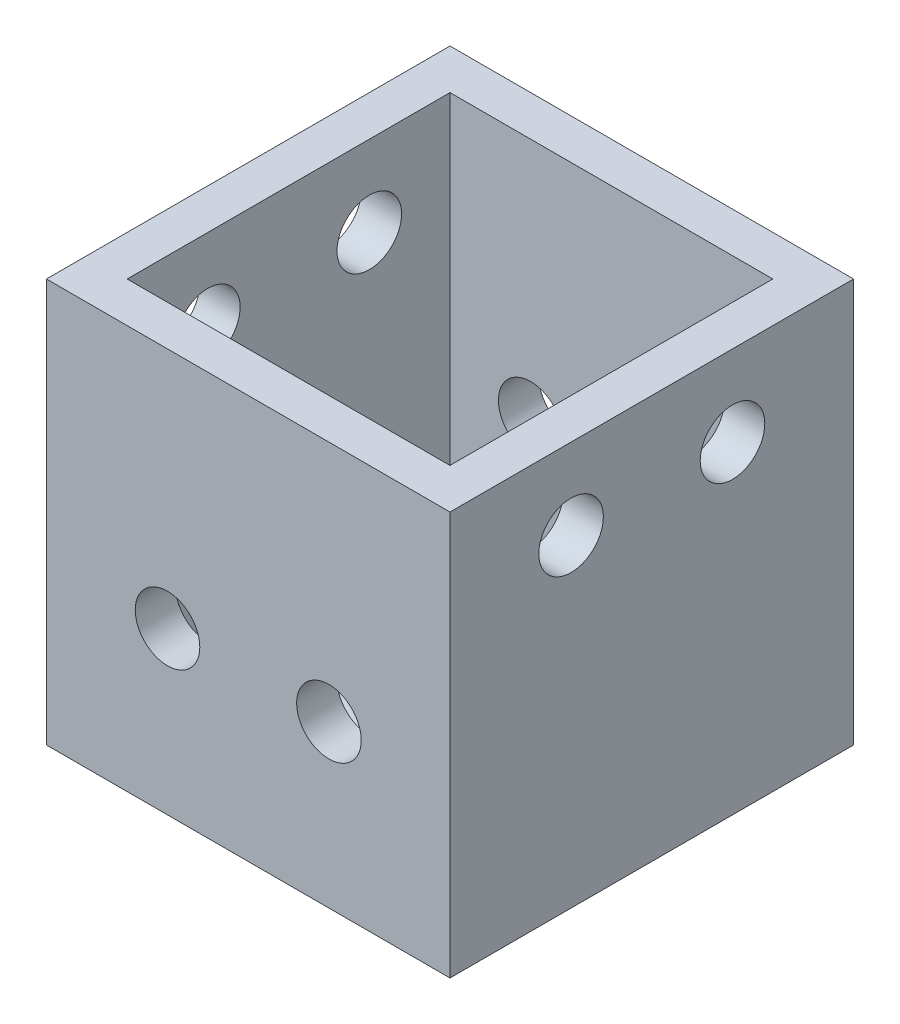
ISO-10303-21;
HEADER;
FILE_DESCRIPTION(('STEP AP214'),'2;1');
FILE_NAME('part.step','',(''),(''),'','','');
FILE_SCHEMA(('AUTOMOTIVE_DESIGN { 1 0 10303 214 1 1 1 1 }'));
ENDSEC;
DATA;
#1=APPLICATION_CONTEXT('core data for automotive mechanical design processes');
#2=APPLICATION_PROTOCOL_DEFINITION('international standard','automotive_design',2000,#1);
#3=PRODUCT_CONTEXT('',#1,'mechanical');
#4=PRODUCT('Part','Part','',(#3));
#5=PRODUCT_RELATED_PRODUCT_CATEGORY('part','',(#4));
#6=PRODUCT_DEFINITION_FORMATION('','',#4);
#7=PRODUCT_DEFINITION_CONTEXT('part definition',#1,'design');
#8=PRODUCT_DEFINITION('design','',#6,#7);
#9=PRODUCT_DEFINITION_SHAPE('','',#8);
#10=(LENGTH_UNIT() NAMED_UNIT(*) SI_UNIT(.MILLI.,.METRE.));
#11=(NAMED_UNIT(*) PLANE_ANGLE_UNIT() SI_UNIT($,.RADIAN.));
#12=(NAMED_UNIT(*) SI_UNIT($,.STERADIAN.) SOLID_ANGLE_UNIT());
#13=UNCERTAINTY_MEASURE_WITH_UNIT(LENGTH_MEASURE(1.E-05),#10,'distance_accuracy_value','');
#14=(GEOMETRIC_REPRESENTATION_CONTEXT(3) GLOBAL_UNCERTAINTY_ASSIGNED_CONTEXT((#13)) GLOBAL_UNIT_ASSIGNED_CONTEXT((#10,
#11,#12)) REPRESENTATION_CONTEXT('',''));
#15=CARTESIAN_POINT('',(0.,0.,0.));
#16=DIRECTION('',(0.,0.,1.));
#17=DIRECTION('',(1.,0.,0.));
#18=AXIS2_PLACEMENT_3D('',#15,#16,#17);
#19=CARTESIAN_POINT('',(0.,50.,0.));
#20=DIRECTION('',(1.,0.,0.));
#21=DIRECTION('',(0.,0.,-1.));
#22=AXIS2_PLACEMENT_3D('',#19,#20,#21);
#23=PLANE('',#22);
#24=CARTESIAN_POINT('',(0.,40.,-15.));
#25=DIRECTION('',(1.,0.,0.));
#26=DIRECTION('',(0.,0.,-1.));
#27=AXIS2_PLACEMENT_3D('',#24,#25,#26);
#28=CIRCLE('',#27,4.);
#29=CARTESIAN_POINT('',(0.,40.,-19.));
#30=VERTEX_POINT('',#29);
#31=EDGE_CURVE('E181',#30,#30,#28,.T.);
#32=ORIENTED_EDGE('',*,*,#31,.T.);
#33=EDGE_LOOP('',(#32));
#34=FACE_BOUND('',#33,.T.);
#35=CARTESIAN_POINT('',(0.,40.,-35.));
#36=DIRECTION('',(1.,0.,0.));
#37=DIRECTION('',(0.,0.,-1.));
#38=AXIS2_PLACEMENT_3D('',#35,#36,#37);
#39=CIRCLE('',#38,4.00000000000001);
#40=CARTESIAN_POINT('',(0.,40.,-39.));
#41=VERTEX_POINT('',#40);
#42=EDGE_CURVE('E188',#41,#41,#39,.T.);
#43=ORIENTED_EDGE('',*,*,#42,.T.);
#44=EDGE_LOOP('',(#43));
#45=FACE_BOUND('',#44,.T.);
#46=DIRECTION('',(0.,0.,1.));
#47=VECTOR('',#46,1.);
#48=CARTESIAN_POINT('',(0.,0.,0.));
#49=LINE('',#48,#47);
#50=CARTESIAN_POINT('',(0.,0.,-50.));
#51=VERTEX_POINT('',#50);
#52=CARTESIAN_POINT('',(0.,0.,0.));
#53=VERTEX_POINT('',#52);
#54=EDGE_CURVE('E146',#51,#53,#49,.T.);
#55=ORIENTED_EDGE('',*,*,#54,.T.);
#56=DIRECTION('',(0.,-1.,0.));
#57=VECTOR('',#56,1.);
#58=CARTESIAN_POINT('',(0.,50.,0.));
#59=LINE('',#58,#57);
#60=CARTESIAN_POINT('',(0.,50.,0.));
#61=VERTEX_POINT('',#60);
#62=EDGE_CURVE('E11',#61,#53,#59,.T.);
#63=ORIENTED_EDGE('',*,*,#62,.F.);
#64=DIRECTION('',(0.,0.,1.));
#65=VECTOR('',#64,1.);
#66=CARTESIAN_POINT('',(0.,50.,0.));
#67=LINE('',#66,#65);
#68=CARTESIAN_POINT('',(0.,50.,-50.));
#69=VERTEX_POINT('',#68);
#70=EDGE_CURVE('E150',#69,#61,#67,.T.);
#71=ORIENTED_EDGE('',*,*,#70,.F.);
#72=DIRECTION('',(0.,-1.,0.));
#73=VECTOR('',#72,1.);
#74=CARTESIAN_POINT('',(0.,50.,-50.));
#75=LINE('',#74,#73);
#76=EDGE_CURVE('E156',#69,#51,#75,.T.);
#77=ORIENTED_EDGE('',*,*,#76,.T.);
#78=EDGE_LOOP('',(#55,#63,#71,#77));
#79=FACE_BOUND('',#78,.T.);
#80=ADVANCED_FACE('F33',(#34,#45,#79),#23,.F.);
#81=CARTESIAN_POINT('',(0.,50.,0.));
#82=DIRECTION('',(0.,0.,-1.));
#83=DIRECTION('',(-1.,0.,0.));
#84=AXIS2_PLACEMENT_3D('',#81,#82,#83);
#85=PLANE('',#84);
#86=CARTESIAN_POINT('',(15.,20.,0.));
#87=DIRECTION('',(0.,0.,-1.));
#88=DIRECTION('',(-1.,0.,0.));
#89=AXIS2_PLACEMENT_3D('',#86,#87,#88);
#90=CIRCLE('',#89,4.);
#91=CARTESIAN_POINT('',(11.,20.,0.));
#92=VERTEX_POINT('',#91);
#93=EDGE_CURVE('E214',#92,#92,#90,.T.);
#94=ORIENTED_EDGE('',*,*,#93,.T.);
#95=EDGE_LOOP('',(#94));
#96=FACE_BOUND('',#95,.T.);
#97=CARTESIAN_POINT('',(35.,20.,0.));
#98=DIRECTION('',(0.,0.,-1.));
#99=DIRECTION('',(-1.,0.,0.));
#100=AXIS2_PLACEMENT_3D('',#97,#98,#99);
#101=CIRCLE('',#100,4.00000000000001);
#102=CARTESIAN_POINT('',(31.,20.,0.));
#103=VERTEX_POINT('',#102);
#104=EDGE_CURVE('E177',#103,#103,#101,.T.);
#105=ORIENTED_EDGE('',*,*,#104,.T.);
#106=EDGE_LOOP('',(#105));
#107=FACE_BOUND('',#106,.T.);
#108=DIRECTION('',(1.,0.,0.));
#109=VECTOR('',#108,1.);
#110=CARTESIAN_POINT('',(0.,0.,0.));
#111=LINE('',#110,#109);
#112=CARTESIAN_POINT('',(50.,0.,0.));
#113=VERTEX_POINT('',#112);
#114=EDGE_CURVE('E159',#53,#113,#111,.T.);
#115=ORIENTED_EDGE('',*,*,#114,.T.);
#116=DIRECTION('',(0.,-1.,0.));
#117=VECTOR('',#116,1.);
#118=CARTESIAN_POINT('',(50.,50.,0.));
#119=LINE('',#118,#117);
#120=CARTESIAN_POINT('',(50.,50.,0.));
#121=VERTEX_POINT('',#120);
#122=EDGE_CURVE('E41',#121,#113,#119,.T.);
#123=ORIENTED_EDGE('',*,*,#122,.F.);
#124=DIRECTION('',(1.,0.,0.));
#125=VECTOR('',#124,1.);
#126=CARTESIAN_POINT('',(0.,50.,0.));
#127=LINE('',#126,#125);
#128=EDGE_CURVE('E86',#61,#121,#127,.T.);
#129=ORIENTED_EDGE('',*,*,#128,.F.);
#130=ORIENTED_EDGE('',*,*,#62,.T.);
#131=EDGE_LOOP('',(#115,#123,#129,#130));
#132=FACE_BOUND('',#131,.T.);
#133=ADVANCED_FACE('F264',(#96,#107,#132),#85,.F.);
#134=CARTESIAN_POINT('',(50.,50.,0.));
#135=DIRECTION('',(-1.,0.,0.));
#136=DIRECTION('',(0.,0.,1.));
#137=AXIS2_PLACEMENT_3D('',#134,#135,#136);
#138=PLANE('',#137);
#139=CARTESIAN_POINT('',(50.,40.,-15.));
#140=DIRECTION('',(-1.,0.,0.));
#141=DIRECTION('',(0.,0.,1.));
#142=AXIS2_PLACEMENT_3D('',#139,#140,#141);
#143=CIRCLE('',#142,4.);
#144=CARTESIAN_POINT('',(50.,40.,-11.));
#145=VERTEX_POINT('',#144);
#146=EDGE_CURVE('E200',#145,#145,#143,.T.);
#147=ORIENTED_EDGE('',*,*,#146,.T.);
#148=EDGE_LOOP('',(#147));
#149=FACE_BOUND('',#148,.T.);
#150=CARTESIAN_POINT('',(50.,40.,-35.));
#151=DIRECTION('',(-1.,0.,0.));
#152=DIRECTION('',(0.,0.,1.));
#153=AXIS2_PLACEMENT_3D('',#150,#151,#152);
#154=CIRCLE('',#153,4.00000000000001);
#155=CARTESIAN_POINT('',(50.,40.,-31.));
#156=VERTEX_POINT('',#155);
#157=EDGE_CURVE('E185',#156,#156,#154,.T.);
#158=ORIENTED_EDGE('',*,*,#157,.T.);
#159=EDGE_LOOP('',(#158));
#160=FACE_BOUND('',#159,.T.);
#161=DIRECTION('',(0.,0.,-1.));
#162=VECTOR('',#161,1.);
#163=CARTESIAN_POINT('',(50.,0.,0.));
#164=LINE('',#163,#162);
#165=CARTESIAN_POINT('',(50.,0.,-50.));
#166=VERTEX_POINT('',#165);
#167=EDGE_CURVE('E161',#113,#166,#164,.T.);
#168=ORIENTED_EDGE('',*,*,#167,.T.);
#169=DIRECTION('',(0.,-1.,0.));
#170=VECTOR('',#169,1.);
#171=CARTESIAN_POINT('',(50.,50.,-50.));
#172=LINE('',#171,#170);
#173=CARTESIAN_POINT('',(50.,50.,-50.));
#174=VERTEX_POINT('',#173);
#175=EDGE_CURVE('E165',#174,#166,#172,.T.);
#176=ORIENTED_EDGE('',*,*,#175,.F.);
#177=DIRECTION('',(0.,0.,-1.));
#178=VECTOR('',#177,1.);
#179=CARTESIAN_POINT('',(50.,50.,0.));
#180=LINE('',#179,#178);
#181=EDGE_CURVE('E153',#121,#174,#180,.T.);
#182=ORIENTED_EDGE('',*,*,#181,.F.);
#183=ORIENTED_EDGE('',*,*,#122,.T.);
#184=EDGE_LOOP('',(#168,#176,#182,#183));
#185=FACE_BOUND('',#184,.T.);
#186=ADVANCED_FACE('F263',(#149,#160,#185),#138,.F.);
#187=CARTESIAN_POINT('',(0.,50.,-50.));
#188=DIRECTION('',(0.,0.,1.));
#189=DIRECTION('',(1.,0.,0.));
#190=AXIS2_PLACEMENT_3D('',#187,#188,#189);
#191=PLANE('',#190);
#192=CARTESIAN_POINT('',(15.,20.,-50.));
#193=DIRECTION('',(0.,0.,1.));
#194=DIRECTION('',(1.,0.,0.));
#195=AXIS2_PLACEMENT_3D('',#192,#193,#194);
#196=CIRCLE('',#195,4.);
#197=CARTESIAN_POINT('',(19.,20.,-50.));
#198=VERTEX_POINT('',#197);
#199=EDGE_CURVE('E173',#198,#198,#196,.T.);
#200=ORIENTED_EDGE('',*,*,#199,.T.);
#201=EDGE_LOOP('',(#200));
#202=FACE_BOUND('',#201,.T.);
#203=CARTESIAN_POINT('',(35.,20.,-50.));
#204=DIRECTION('',(0.,0.,1.));
#205=DIRECTION('',(1.,0.,0.));
#206=AXIS2_PLACEMENT_3D('',#203,#204,#205);
#207=CIRCLE('',#206,4.00000000000001);
#208=CARTESIAN_POINT('',(39.,20.,-50.));
#209=VERTEX_POINT('',#208);
#210=EDGE_CURVE('E203',#209,#209,#207,.T.);
#211=ORIENTED_EDGE('',*,*,#210,.T.);
#212=EDGE_LOOP('',(#211));
#213=FACE_BOUND('',#212,.T.);
#214=DIRECTION('',(-1.,0.,0.));
#215=VECTOR('',#214,1.);
#216=CARTESIAN_POINT('',(0.,0.,-50.));
#217=LINE('',#216,#215);
#218=EDGE_CURVE('E79',#166,#51,#217,.T.);
#219=ORIENTED_EDGE('',*,*,#218,.T.);
#220=ORIENTED_EDGE('',*,*,#76,.F.);
#221=DIRECTION('',(-1.,0.,0.));
#222=VECTOR('',#221,1.);
#223=CARTESIAN_POINT('',(0.,50.,-50.));
#224=LINE('',#223,#222);
#225=EDGE_CURVE('E58',#174,#69,#224,.T.);
#226=ORIENTED_EDGE('',*,*,#225,.F.);
#227=ORIENTED_EDGE('',*,*,#175,.T.);
#228=EDGE_LOOP('',(#219,#220,#226,#227));
#229=FACE_BOUND('',#228,.T.);
#230=ADVANCED_FACE('F259',(#202,#213,#229),#191,.F.);
#231=CARTESIAN_POINT('',(0.,50.,0.));
#232=DIRECTION('',(0.,-1.,0.));
#233=DIRECTION('',(0.,0.,-1.));
#234=AXIS2_PLACEMENT_3D('',#231,#232,#233);
#235=PLANE('',#234);
#236=DIRECTION('',(1.,0.,0.));
#237=VECTOR('',#236,1.);
#238=CARTESIAN_POINT('',(5.,50.,-5.));
#239=LINE('',#238,#237);
#240=CARTESIAN_POINT('',(5.,50.,-5.));
#241=VERTEX_POINT('',#240);
#242=CARTESIAN_POINT('',(45.,50.,-5.));
#243=VERTEX_POINT('',#242);
#244=EDGE_CURVE('E140',#241,#243,#239,.T.);
#245=ORIENTED_EDGE('',*,*,#244,.F.);
#246=DIRECTION('',(0.,0.,1.));
#247=VECTOR('',#246,1.);
#248=CARTESIAN_POINT('',(5.,50.,-45.));
#249=LINE('',#248,#247);
#250=CARTESIAN_POINT('',(5.,50.,-45.));
#251=VERTEX_POINT('',#250);
#252=EDGE_CURVE('E49',#251,#241,#249,.T.);
#253=ORIENTED_EDGE('',*,*,#252,.F.);
#254=DIRECTION('',(-1.,0.,0.));
#255=VECTOR('',#254,1.);
#256=CARTESIAN_POINT('',(5.,50.,-45.));
#257=LINE('',#256,#255);
#258=CARTESIAN_POINT('',(45.,50.,-45.));
#259=VERTEX_POINT('',#258);
#260=EDGE_CURVE('E128',#259,#251,#257,.T.);
#261=ORIENTED_EDGE('',*,*,#260,.F.);
#262=DIRECTION('',(0.,0.,-1.));
#263=VECTOR('',#262,1.);
#264=CARTESIAN_POINT('',(45.,50.,-45.));
#265=LINE('',#264,#263);
#266=EDGE_CURVE('E131',#243,#259,#265,.T.);
#267=ORIENTED_EDGE('',*,*,#266,.F.);
#268=EDGE_LOOP('',(#245,#253,#261,#267));
#269=FACE_BOUND('',#268,.T.);
#270=ORIENTED_EDGE('',*,*,#70,.T.);
#271=ORIENTED_EDGE('',*,*,#128,.T.);
#272=ORIENTED_EDGE('',*,*,#181,.T.);
#273=ORIENTED_EDGE('',*,*,#225,.T.);
#274=EDGE_LOOP('',(#270,#271,#272,#273));
#275=FACE_BOUND('',#274,.T.);
#276=ADVANCED_FACE('F247',(#269,#275),#235,.F.);
#277=CARTESIAN_POINT('',(0.,0.,0.));
#278=DIRECTION('',(0.,-1.,0.));
#279=DIRECTION('',(0.,0.,-1.));
#280=AXIS2_PLACEMENT_3D('',#277,#278,#279);
#281=PLANE('',#280);
#282=CARTESIAN_POINT('',(37.,0.,-37.));
#283=DIRECTION('',(0.,-1.,0.));
#284=DIRECTION('',(0.,0.,-1.));
#285=AXIS2_PLACEMENT_3D('',#282,#283,#284);
#286=CIRCLE('',#285,4.00000000000001);
#287=CARTESIAN_POINT('',(37.,0.,-33.));
#288=VERTEX_POINT('',#287);
#289=EDGE_CURVE('E134',#288,#288,#286,.T.);
#290=ORIENTED_EDGE('',*,*,#289,.F.);
#291=EDGE_LOOP('',(#290));
#292=FACE_BOUND('',#291,.T.);
#293=CARTESIAN_POINT('',(13.,0.,-13.));
#294=DIRECTION('',(0.,-1.,0.));
#295=DIRECTION('',(0.,0.,-1.));
#296=AXIS2_PLACEMENT_3D('',#293,#294,#295);
#297=CIRCLE('',#296,4.);
#298=CARTESIAN_POINT('',(13.,0.,-9.00000000000001));
#299=VERTEX_POINT('',#298);
#300=EDGE_CURVE('E234',#299,#299,#297,.T.);
#301=ORIENTED_EDGE('',*,*,#300,.F.);
#302=EDGE_LOOP('',(#301));
#303=FACE_BOUND('',#302,.T.);
#304=CARTESIAN_POINT('',(37.,0.,-13.));
#305=DIRECTION('',(0.,-1.,0.));
#306=DIRECTION('',(0.,0.,-1.));
#307=AXIS2_PLACEMENT_3D('',#304,#305,#306);
#308=CIRCLE('',#307,4.00000000000001);
#309=CARTESIAN_POINT('',(37.,0.,-8.99999999999999));
#310=VERTEX_POINT('',#309);
#311=EDGE_CURVE('E232',#310,#310,#308,.T.);
#312=ORIENTED_EDGE('',*,*,#311,.F.);
#313=EDGE_LOOP('',(#312));
#314=FACE_BOUND('',#313,.T.);
#315=CARTESIAN_POINT('',(13.,0.,-37.));
#316=DIRECTION('',(0.,-1.,0.));
#317=DIRECTION('',(0.,0.,-1.));
#318=AXIS2_PLACEMENT_3D('',#315,#316,#317);
#319=CIRCLE('',#318,4.);
#320=CARTESIAN_POINT('',(13.,0.,-33.));
#321=VERTEX_POINT('',#320);
#322=EDGE_CURVE('E229',#321,#321,#319,.T.);
#323=ORIENTED_EDGE('',*,*,#322,.F.);
#324=EDGE_LOOP('',(#323));
#325=FACE_BOUND('',#324,.T.);
#326=ORIENTED_EDGE('',*,*,#54,.F.);
#327=ORIENTED_EDGE('',*,*,#218,.F.);
#328=ORIENTED_EDGE('',*,*,#167,.F.);
#329=ORIENTED_EDGE('',*,*,#114,.F.);
#330=EDGE_LOOP('',(#326,#327,#328,#329));
#331=FACE_BOUND('',#330,.T.);
#332=ADVANCED_FACE('F244',(#292,#303,#314,#325,#331),#281,.T.);
#333=CARTESIAN_POINT('',(5.,5.,-45.));
#334=DIRECTION('',(-1.,0.,0.));
#335=DIRECTION('',(0.,0.,1.));
#336=AXIS2_PLACEMENT_3D('',#333,#334,#335);
#337=PLANE('',#336);
#338=CARTESIAN_POINT('',(5.,40.,-15.));
#339=DIRECTION('',(-1.,0.,0.));
#340=DIRECTION('',(0.,0.,1.));
#341=AXIS2_PLACEMENT_3D('',#338,#339,#340);
#342=CIRCLE('',#341,4.);
#343=CARTESIAN_POINT('',(5.,40.,-11.));
#344=VERTEX_POINT('',#343);
#345=EDGE_CURVE('E197',#344,#344,#342,.T.);
#346=ORIENTED_EDGE('',*,*,#345,.T.);
#347=EDGE_LOOP('',(#346));
#348=FACE_BOUND('',#347,.T.);
#349=CARTESIAN_POINT('',(5.,40.,-35.));
#350=DIRECTION('',(-1.,0.,0.));
#351=DIRECTION('',(0.,0.,1.));
#352=AXIS2_PLACEMENT_3D('',#349,#350,#351);
#353=CIRCLE('',#352,4.00000000000001);
#354=CARTESIAN_POINT('',(5.,40.,-31.));
#355=VERTEX_POINT('',#354);
#356=EDGE_CURVE('E180',#355,#355,#353,.T.);
#357=ORIENTED_EDGE('',*,*,#356,.T.);
#358=EDGE_LOOP('',(#357));
#359=FACE_BOUND('',#358,.T.);
#360=ORIENTED_EDGE('',*,*,#252,.T.);
#361=DIRECTION('',(0.,1.,0.));
#362=VECTOR('',#361,1.);
#363=CARTESIAN_POINT('',(5.,5.,-5.));
#364=LINE('',#363,#362);
#365=CARTESIAN_POINT('',(5.,5.,-5.));
#366=VERTEX_POINT('',#365);
#367=EDGE_CURVE('E106',#366,#241,#364,.T.);
#368=ORIENTED_EDGE('',*,*,#367,.F.);
#369=DIRECTION('',(0.,0.,1.));
#370=VECTOR('',#369,1.);
#371=CARTESIAN_POINT('',(5.,5.,-45.));
#372=LINE('',#371,#370);
#373=CARTESIAN_POINT('',(5.,5.,-45.));
#374=VERTEX_POINT('',#373);
#375=EDGE_CURVE('E110',#374,#366,#372,.T.);
#376=ORIENTED_EDGE('',*,*,#375,.F.);
#377=DIRECTION('',(0.,1.,0.));
#378=VECTOR('',#377,1.);
#379=CARTESIAN_POINT('',(5.,5.,-45.));
#380=LINE('',#379,#378);
#381=EDGE_CURVE('E144',#374,#251,#380,.T.);
#382=ORIENTED_EDGE('',*,*,#381,.T.);
#383=EDGE_LOOP('',(#360,#368,#376,#382));
#384=FACE_BOUND('',#383,.T.);
#385=ADVANCED_FACE('F108',(#348,#359,#384),#337,.F.);
#386=CARTESIAN_POINT('',(5.,5.,-45.));
#387=DIRECTION('',(0.,0.,-1.));
#388=DIRECTION('',(-1.,0.,0.));
#389=AXIS2_PLACEMENT_3D('',#386,#387,#388);
#390=PLANE('',#389);
#391=CARTESIAN_POINT('',(15.,20.,-45.));
#392=DIRECTION('',(0.,0.,-1.));
#393=DIRECTION('',(-1.,0.,0.));
#394=AXIS2_PLACEMENT_3D('',#391,#392,#393);
#395=CIRCLE('',#394,4.);
#396=CARTESIAN_POINT('',(11.,20.,-45.));
#397=VERTEX_POINT('',#396);
#398=EDGE_CURVE('E176',#397,#397,#395,.T.);
#399=ORIENTED_EDGE('',*,*,#398,.T.);
#400=EDGE_LOOP('',(#399));
#401=FACE_BOUND('',#400,.T.);
#402=CARTESIAN_POINT('',(35.,20.,-45.));
#403=DIRECTION('',(0.,0.,-1.));
#404=DIRECTION('',(-1.,0.,0.));
#405=AXIS2_PLACEMENT_3D('',#402,#403,#404);
#406=CIRCLE('',#405,4.00000000000001);
#407=CARTESIAN_POINT('',(31.,20.,-45.));
#408=VERTEX_POINT('',#407);
#409=EDGE_CURVE('E172',#408,#408,#406,.T.);
#410=ORIENTED_EDGE('',*,*,#409,.T.);
#411=EDGE_LOOP('',(#410));
#412=FACE_BOUND('',#411,.T.);
#413=ORIENTED_EDGE('',*,*,#260,.T.);
#414=ORIENTED_EDGE('',*,*,#381,.F.);
#415=DIRECTION('',(-1.,0.,0.));
#416=VECTOR('',#415,1.);
#417=CARTESIAN_POINT('',(5.,5.,-45.));
#418=LINE('',#417,#416);
#419=CARTESIAN_POINT('',(45.,5.,-45.));
#420=VERTEX_POINT('',#419);
#421=EDGE_CURVE('E116',#420,#374,#418,.T.);
#422=ORIENTED_EDGE('',*,*,#421,.F.);
#423=DIRECTION('',(0.,1.,0.));
#424=VECTOR('',#423,1.);
#425=CARTESIAN_POINT('',(45.,5.,-45.));
#426=LINE('',#425,#424);
#427=EDGE_CURVE('E147',#420,#259,#426,.T.);
#428=ORIENTED_EDGE('',*,*,#427,.T.);
#429=EDGE_LOOP('',(#413,#414,#422,#428));
#430=FACE_BOUND('',#429,.T.);
#431=ADVANCED_FACE('F283',(#401,#412,#430),#390,.F.);
#432=CARTESIAN_POINT('',(45.,5.,-45.));
#433=DIRECTION('',(1.,0.,0.));
#434=DIRECTION('',(0.,0.,-1.));
#435=AXIS2_PLACEMENT_3D('',#432,#433,#434);
#436=PLANE('',#435);
#437=CARTESIAN_POINT('',(45.,40.,-15.));
#438=DIRECTION('',(1.,0.,0.));
#439=DIRECTION('',(0.,0.,-1.));
#440=AXIS2_PLACEMENT_3D('',#437,#438,#439);
#441=CIRCLE('',#440,4.);
#442=CARTESIAN_POINT('',(45.,40.,-19.));
#443=VERTEX_POINT('',#442);
#444=EDGE_CURVE('E36',#443,#443,#441,.T.);
#445=ORIENTED_EDGE('',*,*,#444,.T.);
#446=EDGE_LOOP('',(#445));
#447=FACE_BOUND('',#446,.T.);
#448=CARTESIAN_POINT('',(45.,40.,-35.));
#449=DIRECTION('',(1.,0.,0.));
#450=DIRECTION('',(0.,0.,-1.));
#451=AXIS2_PLACEMENT_3D('',#448,#449,#450);
#452=CIRCLE('',#451,4.00000000000001);
#453=CARTESIAN_POINT('',(45.,40.,-39.));
#454=VERTEX_POINT('',#453);
#455=EDGE_CURVE('E178',#454,#454,#452,.T.);
#456=ORIENTED_EDGE('',*,*,#455,.T.);
#457=EDGE_LOOP('',(#456));
#458=FACE_BOUND('',#457,.T.);
#459=ORIENTED_EDGE('',*,*,#266,.T.);
#460=ORIENTED_EDGE('',*,*,#427,.F.);
#461=DIRECTION('',(0.,0.,-1.));
#462=VECTOR('',#461,1.);
#463=CARTESIAN_POINT('',(45.,5.,-45.));
#464=LINE('',#463,#462);
#465=CARTESIAN_POINT('',(45.,5.,-5.));
#466=VERTEX_POINT('',#465);
#467=EDGE_CURVE('E124',#466,#420,#464,.T.);
#468=ORIENTED_EDGE('',*,*,#467,.F.);
#469=DIRECTION('',(0.,1.,0.));
#470=VECTOR('',#469,1.);
#471=CARTESIAN_POINT('',(45.,5.,-5.));
#472=LINE('',#471,#470);
#473=EDGE_CURVE('E115',#466,#243,#472,.T.);
#474=ORIENTED_EDGE('',*,*,#473,.T.);
#475=EDGE_LOOP('',(#459,#460,#468,#474));
#476=FACE_BOUND('',#475,.T.);
#477=ADVANCED_FACE('F287',(#447,#458,#476),#436,.F.);
#478=CARTESIAN_POINT('',(5.,5.,-5.));
#479=DIRECTION('',(0.,0.,1.));
#480=DIRECTION('',(1.,0.,0.));
#481=AXIS2_PLACEMENT_3D('',#478,#479,#480);
#482=PLANE('',#481);
#483=CARTESIAN_POINT('',(15.,20.,-5.));
#484=DIRECTION('',(0.,0.,1.));
#485=DIRECTION('',(1.,0.,0.));
#486=AXIS2_PLACEMENT_3D('',#483,#484,#485);
#487=CIRCLE('',#486,4.);
#488=CARTESIAN_POINT('',(19.,20.,-5.));
#489=VERTEX_POINT('',#488);
#490=EDGE_CURVE('E174',#489,#489,#487,.T.);
#491=ORIENTED_EDGE('',*,*,#490,.T.);
#492=EDGE_LOOP('',(#491));
#493=FACE_BOUND('',#492,.T.);
#494=CARTESIAN_POINT('',(35.,20.,-5.));
#495=DIRECTION('',(0.,0.,1.));
#496=DIRECTION('',(1.,0.,0.));
#497=AXIS2_PLACEMENT_3D('',#494,#495,#496);
#498=CIRCLE('',#497,4.00000000000001);
#499=CARTESIAN_POINT('',(39.,20.,-5.));
#500=VERTEX_POINT('',#499);
#501=EDGE_CURVE('E169',#500,#500,#498,.T.);
#502=ORIENTED_EDGE('',*,*,#501,.T.);
#503=EDGE_LOOP('',(#502));
#504=FACE_BOUND('',#503,.T.);
#505=ORIENTED_EDGE('',*,*,#244,.T.);
#506=ORIENTED_EDGE('',*,*,#473,.F.);
#507=DIRECTION('',(1.,0.,0.));
#508=VECTOR('',#507,1.);
#509=CARTESIAN_POINT('',(5.,5.,-5.));
#510=LINE('',#509,#508);
#511=EDGE_CURVE('E119',#366,#466,#510,.T.);
#512=ORIENTED_EDGE('',*,*,#511,.F.);
#513=ORIENTED_EDGE('',*,*,#367,.T.);
#514=EDGE_LOOP('',(#505,#506,#512,#513));
#515=FACE_BOUND('',#514,.T.);
#516=ADVANCED_FACE('F120',(#493,#504,#515),#482,.F.);
#517=CARTESIAN_POINT('',(0.,5.,0.));
#518=DIRECTION('',(0.,1.,0.));
#519=DIRECTION('',(0.,0.,1.));
#520=AXIS2_PLACEMENT_3D('',#517,#518,#519);
#521=PLANE('',#520);
#522=CARTESIAN_POINT('',(37.,5.,-37.));
#523=DIRECTION('',(0.,1.,0.));
#524=DIRECTION('',(0.,0.,1.));
#525=AXIS2_PLACEMENT_3D('',#522,#523,#524);
#526=CIRCLE('',#525,4.00000000000001);
#527=CARTESIAN_POINT('',(37.,5.,-33.));
#528=VERTEX_POINT('',#527);
#529=EDGE_CURVE('E221',#528,#528,#526,.T.);
#530=ORIENTED_EDGE('',*,*,#529,.F.);
#531=EDGE_LOOP('',(#530));
#532=FACE_BOUND('',#531,.T.);
#533=CARTESIAN_POINT('',(13.,5.,-13.));
#534=DIRECTION('',(0.,1.,0.));
#535=DIRECTION('',(0.,0.,1.));
#536=AXIS2_PLACEMENT_3D('',#533,#534,#535);
#537=CIRCLE('',#536,4.);
#538=CARTESIAN_POINT('',(13.,5.,-9.00000000000001));
#539=VERTEX_POINT('',#538);
#540=EDGE_CURVE('E220',#539,#539,#537,.T.);
#541=ORIENTED_EDGE('',*,*,#540,.F.);
#542=EDGE_LOOP('',(#541));
#543=FACE_BOUND('',#542,.T.);
#544=CARTESIAN_POINT('',(37.,5.,-13.));
#545=DIRECTION('',(0.,1.,0.));
#546=DIRECTION('',(0.,0.,1.));
#547=AXIS2_PLACEMENT_3D('',#544,#545,#546);
#548=CIRCLE('',#547,4.00000000000001);
#549=CARTESIAN_POINT('',(37.,5.,-8.99999999999999));
#550=VERTEX_POINT('',#549);
#551=EDGE_CURVE('E217',#550,#550,#548,.T.);
#552=ORIENTED_EDGE('',*,*,#551,.F.);
#553=EDGE_LOOP('',(#552));
#554=FACE_BOUND('',#553,.T.);
#555=CARTESIAN_POINT('',(13.,5.,-37.));
#556=DIRECTION('',(0.,1.,0.));
#557=DIRECTION('',(0.,0.,1.));
#558=AXIS2_PLACEMENT_3D('',#555,#556,#557);
#559=CIRCLE('',#558,4.);
#560=CARTESIAN_POINT('',(13.,5.,-33.));
#561=VERTEX_POINT('',#560);
#562=EDGE_CURVE('E224',#561,#561,#559,.T.);
#563=ORIENTED_EDGE('',*,*,#562,.F.);
#564=EDGE_LOOP('',(#563));
#565=FACE_BOUND('',#564,.T.);
#566=ORIENTED_EDGE('',*,*,#375,.T.);
#567=ORIENTED_EDGE('',*,*,#511,.T.);
#568=ORIENTED_EDGE('',*,*,#467,.T.);
#569=ORIENTED_EDGE('',*,*,#421,.T.);
#570=EDGE_LOOP('',(#566,#567,#568,#569));
#571=FACE_BOUND('',#570,.T.);
#572=ADVANCED_FACE('F126',(#532,#543,#554,#565,#571),#521,.T.);
#573=CARTESIAN_POINT('',(13.,-40.,-37.));
#574=DIRECTION('',(0.,1.,0.));
#575=DIRECTION('',(0.,0.,1.));
#576=AXIS2_PLACEMENT_3D('',#573,#574,#575);
#577=CYLINDRICAL_SURFACE('',#576,4.);
#578=CARTESIAN_POINT('',(13.,0.,-33.));
#579=CARTESIAN_POINT('',(13.,0.0520833333333392,-33.));
#580=CARTESIAN_POINT('',(13.,0.104166666666671,-33.));
#581=CARTESIAN_POINT('',(13.,0.208333333333338,-33.));
#582=CARTESIAN_POINT('',(13.,0.260416666666673,-33.));
#583=CARTESIAN_POINT('',(13.,0.364583333333339,-33.));
#584=CARTESIAN_POINT('',(13.,0.416666666666672,-33.));
#585=CARTESIAN_POINT('',(13.,0.520833333333338,-33.));
#586=CARTESIAN_POINT('',(13.,0.572916666666673,-33.));
#587=CARTESIAN_POINT('',(13.,0.67708333333334,-33.));
#588=CARTESIAN_POINT('',(13.,0.729166666666672,-33.));
#589=CARTESIAN_POINT('',(13.,0.833333333333339,-33.));
#590=CARTESIAN_POINT('',(13.,0.885416666666673,-33.));
#591=CARTESIAN_POINT('',(13.,0.98958333333334,-33.));
#592=CARTESIAN_POINT('',(13.,1.04166666666667,-33.));
#593=CARTESIAN_POINT('',(13.,1.14583333333334,-33.));
#594=CARTESIAN_POINT('',(13.,1.19791666666667,-33.));
#595=CARTESIAN_POINT('',(13.,1.30208333333334,-33.));
#596=CARTESIAN_POINT('',(13.,1.35416666666667,-33.));
#597=CARTESIAN_POINT('',(13.,1.45833333333334,-33.));
#598=CARTESIAN_POINT('',(13.,1.51041666666667,-33.));
#599=CARTESIAN_POINT('',(13.,1.61458333333334,-33.));
#600=CARTESIAN_POINT('',(13.,1.66666666666667,-33.));
#601=CARTESIAN_POINT('',(13.,1.77083333333334,-33.));
#602=CARTESIAN_POINT('',(13.,1.82291666666667,-33.));
#603=CARTESIAN_POINT('',(13.,1.92708333333334,-33.));
#604=CARTESIAN_POINT('',(13.,1.97916666666667,-33.));
#605=CARTESIAN_POINT('',(13.,2.08333333333334,-33.));
#606=CARTESIAN_POINT('',(13.,2.13541666666667,-33.));
#607=CARTESIAN_POINT('',(13.,2.23958333333334,-33.));
#608=CARTESIAN_POINT('',(13.,2.29166666666667,-33.));
#609=CARTESIAN_POINT('',(13.,2.39583333333334,-33.));
#610=CARTESIAN_POINT('',(13.,2.44791666666667,-33.));
#611=CARTESIAN_POINT('',(13.,2.55208333333333,-33.));
#612=CARTESIAN_POINT('',(13.,2.60416666666667,-33.));
#613=CARTESIAN_POINT('',(13.,2.70833333333333,-33.));
#614=CARTESIAN_POINT('',(13.,2.76041666666667,-33.));
#615=CARTESIAN_POINT('',(13.,2.86458333333333,-33.));
#616=CARTESIAN_POINT('',(13.,2.91666666666667,-33.));
#617=CARTESIAN_POINT('',(13.,3.02083333333333,-33.));
#618=CARTESIAN_POINT('',(13.,3.07291666666667,-33.));
#619=CARTESIAN_POINT('',(13.,3.17708333333334,-33.));
#620=CARTESIAN_POINT('',(13.,3.22916666666667,-33.));
#621=CARTESIAN_POINT('',(13.,3.33333333333333,-33.));
#622=CARTESIAN_POINT('',(13.,3.38541666666667,-33.));
#623=CARTESIAN_POINT('',(13.,3.48958333333334,-33.));
#624=CARTESIAN_POINT('',(13.,3.54166666666667,-33.));
#625=CARTESIAN_POINT('',(13.,3.64583333333333,-33.));
#626=CARTESIAN_POINT('',(13.,3.69791666666666,-33.));
#627=CARTESIAN_POINT('',(13.,3.80208333333333,-33.));
#628=CARTESIAN_POINT('',(13.,3.85416666666667,-33.));
#629=CARTESIAN_POINT('',(13.,3.95833333333333,-33.));
#630=CARTESIAN_POINT('',(13.,4.01041666666666,-33.));
#631=CARTESIAN_POINT('',(13.,4.11458333333333,-33.));
#632=CARTESIAN_POINT('',(13.,4.16666666666667,-33.));
#633=CARTESIAN_POINT('',(13.,4.27083333333333,-33.));
#634=CARTESIAN_POINT('',(13.,4.32291666666667,-33.));
#635=CARTESIAN_POINT('',(13.,4.42708333333333,-33.));
#636=CARTESIAN_POINT('',(13.,4.47916666666667,-33.));
#637=CARTESIAN_POINT('',(13.,4.58333333333333,-33.));
#638=CARTESIAN_POINT('',(13.,4.63541666666667,-33.));
#639=CARTESIAN_POINT('',(13.,4.73958333333333,-33.));
#640=CARTESIAN_POINT('',(13.,4.79166666666667,-33.));
#641=CARTESIAN_POINT('',(13.,4.89583333333333,-33.));
#642=CARTESIAN_POINT('',(13.,4.94791666666667,-33.));
#643=CARTESIAN_POINT('',(13.,5.,-33.));
#644=B_SPLINE_CURVE_WITH_KNOTS('',3,(#578,#579,#580,#581,#582,#583,#584,#585,#586,#587,#588,
#589,#590,#591,#592,#593,#594,#595,#596,#597,#598,#599,#600,#601,#602,#603,#604,#605,#606,#607,
#608,#609,#610,#611,#612,#613,#614,#615,#616,#617,#618,#619,#620,#621,#622,#623,#624,#625,#626,
#627,#628,#629,#630,#631,#632,#633,#634,#635,#636,#637,#638,#639,#640,#641,#642,#643),
.UNSPECIFIED.,.F.,.F.,(4,2,2,2,2,2,2,2,2,2,2,2,2,2,2,2,2,2,2,2,2,2,2,2,2,2,2,2,2,2,2,2,4),(0.,
0.156249999999997,0.3125,0.468749999999997,0.625000000000001,0.781249999999997,
0.937500000000001,1.09375,1.25,1.40625,1.56249999999999,1.71875,1.87499999999999,2.03125,2.1875,
2.34375,2.5,2.65624999999999,2.8125,2.96874999999999,3.125,3.28124999999999,3.4375,
3.59374999999999,3.74999999999999,3.90624999999999,4.06249999999999,4.21874999999999,
4.37499999999999,4.53124999999999,4.68749999999999,4.84374999999999,4.99999999999999),.UNSPECIFIED.);
#645=EDGE_CURVE('BSEAM297',#321,#561,#644,.T.);
#646=ORIENTED_EDGE('',*,*,#322,.T.);
#647=ORIENTED_EDGE('',*,*,#562,.T.);
#648=ORIENTED_EDGE('',*,*,#645,.T.);
#649=ORIENTED_EDGE('',*,*,#645,.F.);
#650=EDGE_LOOP('',(#646,#648,#647,#649));
#651=FACE_BOUND('',#650,.T.);
#652=ADVANCED_FACE('F297',(#651),#577,.F.);
#653=CARTESIAN_POINT('',(37.,-40.,-13.));
#654=DIRECTION('',(0.,1.,0.));
#655=DIRECTION('',(0.,0.,1.));
#656=AXIS2_PLACEMENT_3D('',#653,#654,#655);
#657=CYLINDRICAL_SURFACE('',#656,4.00000000000001);
#658=CARTESIAN_POINT('',(37.,0.,-8.99999999999999));
#659=CARTESIAN_POINT('',(37.,0.0520833333333392,-8.99999999999999));
#660=CARTESIAN_POINT('',(37.,0.104166666666671,-8.99999999999999));
#661=CARTESIAN_POINT('',(37.,0.208333333333338,-8.99999999999999));
#662=CARTESIAN_POINT('',(37.,0.260416666666673,-8.99999999999999));
#663=CARTESIAN_POINT('',(37.,0.364583333333339,-8.99999999999999));
#664=CARTESIAN_POINT('',(37.,0.416666666666672,-8.99999999999999));
#665=CARTESIAN_POINT('',(37.,0.520833333333338,-8.99999999999999));
#666=CARTESIAN_POINT('',(37.,0.572916666666673,-8.99999999999999));
#667=CARTESIAN_POINT('',(37.,0.67708333333334,-8.99999999999999));
#668=CARTESIAN_POINT('',(37.,0.729166666666672,-8.99999999999999));
#669=CARTESIAN_POINT('',(37.,0.833333333333339,-8.99999999999999));
#670=CARTESIAN_POINT('',(37.,0.885416666666673,-8.99999999999999));
#671=CARTESIAN_POINT('',(37.,0.98958333333334,-8.99999999999999));
#672=CARTESIAN_POINT('',(37.,1.04166666666667,-8.99999999999999));
#673=CARTESIAN_POINT('',(37.,1.14583333333334,-8.99999999999999));
#674=CARTESIAN_POINT('',(37.,1.19791666666667,-8.99999999999999));
#675=CARTESIAN_POINT('',(37.,1.30208333333334,-8.99999999999999));
#676=CARTESIAN_POINT('',(37.,1.35416666666667,-8.99999999999999));
#677=CARTESIAN_POINT('',(37.,1.45833333333334,-8.99999999999999));
#678=CARTESIAN_POINT('',(37.,1.51041666666667,-8.99999999999999));
#679=CARTESIAN_POINT('',(37.,1.61458333333334,-8.99999999999999));
#680=CARTESIAN_POINT('',(37.,1.66666666666667,-8.99999999999999));
#681=CARTESIAN_POINT('',(37.,1.77083333333334,-8.99999999999999));
#682=CARTESIAN_POINT('',(37.,1.82291666666667,-8.99999999999999));
#683=CARTESIAN_POINT('',(37.,1.92708333333334,-8.99999999999999));
#684=CARTESIAN_POINT('',(37.,1.97916666666667,-8.99999999999999));
#685=CARTESIAN_POINT('',(37.,2.08333333333334,-8.99999999999999));
#686=CARTESIAN_POINT('',(37.,2.13541666666667,-8.99999999999999));
#687=CARTESIAN_POINT('',(37.,2.23958333333334,-8.99999999999999));
#688=CARTESIAN_POINT('',(37.,2.29166666666667,-8.99999999999999));
#689=CARTESIAN_POINT('',(37.,2.39583333333334,-8.99999999999999));
#690=CARTESIAN_POINT('',(37.,2.44791666666667,-8.99999999999999));
#691=CARTESIAN_POINT('',(37.,2.55208333333333,-8.99999999999999));
#692=CARTESIAN_POINT('',(37.,2.60416666666667,-8.99999999999999));
#693=CARTESIAN_POINT('',(37.,2.70833333333333,-8.99999999999999));
#694=CARTESIAN_POINT('',(37.,2.76041666666667,-8.99999999999999));
#695=CARTESIAN_POINT('',(37.,2.86458333333333,-8.99999999999999));
#696=CARTESIAN_POINT('',(37.,2.91666666666667,-8.99999999999999));
#697=CARTESIAN_POINT('',(37.,3.02083333333333,-8.99999999999999));
#698=CARTESIAN_POINT('',(37.,3.07291666666667,-8.99999999999999));
#699=CARTESIAN_POINT('',(37.,3.17708333333334,-8.99999999999999));
#700=CARTESIAN_POINT('',(37.,3.22916666666667,-8.99999999999999));
#701=CARTESIAN_POINT('',(37.,3.33333333333333,-8.99999999999999));
#702=CARTESIAN_POINT('',(37.,3.38541666666667,-8.99999999999999));
#703=CARTESIAN_POINT('',(37.,3.48958333333334,-8.99999999999999));
#704=CARTESIAN_POINT('',(37.,3.54166666666667,-8.99999999999999));
#705=CARTESIAN_POINT('',(37.,3.64583333333333,-8.99999999999999));
#706=CARTESIAN_POINT('',(37.,3.69791666666666,-8.99999999999999));
#707=CARTESIAN_POINT('',(37.,3.80208333333333,-8.99999999999999));
#708=CARTESIAN_POINT('',(37.,3.85416666666667,-8.99999999999999));
#709=CARTESIAN_POINT('',(37.,3.95833333333333,-8.99999999999999));
#710=CARTESIAN_POINT('',(37.,4.01041666666666,-8.99999999999999));
#711=CARTESIAN_POINT('',(37.,4.11458333333333,-8.99999999999999));
#712=CARTESIAN_POINT('',(37.,4.16666666666667,-8.99999999999999));
#713=CARTESIAN_POINT('',(37.,4.27083333333333,-8.99999999999999));
#714=CARTESIAN_POINT('',(37.,4.32291666666667,-8.99999999999999));
#715=CARTESIAN_POINT('',(37.,4.42708333333333,-8.99999999999999));
#716=CARTESIAN_POINT('',(37.,4.47916666666667,-8.99999999999999));
#717=CARTESIAN_POINT('',(37.,4.58333333333333,-8.99999999999999));
#718=CARTESIAN_POINT('',(37.,4.63541666666667,-8.99999999999999));
#719=CARTESIAN_POINT('',(37.,4.73958333333333,-8.99999999999999));
#720=CARTESIAN_POINT('',(37.,4.79166666666667,-8.99999999999999));
#721=CARTESIAN_POINT('',(37.,4.89583333333333,-8.99999999999999));
#722=CARTESIAN_POINT('',(37.,4.94791666666667,-8.99999999999999));
#723=CARTESIAN_POINT('',(37.,5.,-8.99999999999999));
#724=B_SPLINE_CURVE_WITH_KNOTS('',3,(#658,#659,#660,#661,#662,#663,#664,#665,#666,#667,#668,
#669,#670,#671,#672,#673,#674,#675,#676,#677,#678,#679,#680,#681,#682,#683,#684,#685,#686,#687,
#688,#689,#690,#691,#692,#693,#694,#695,#696,#697,#698,#699,#700,#701,#702,#703,#704,#705,#706,
#707,#708,#709,#710,#711,#712,#713,#714,#715,#716,#717,#718,#719,#720,#721,#722,#723),
.UNSPECIFIED.,.F.,.F.,(4,2,2,2,2,2,2,2,2,2,2,2,2,2,2,2,2,2,2,2,2,2,2,2,2,2,2,2,2,2,2,2,4),(0.,
0.156249999999997,0.3125,0.468749999999997,0.625000000000001,0.781249999999997,
0.937500000000001,1.09375,1.25,1.40625,1.56249999999999,1.71875,1.87499999999999,2.03125,2.1875,
2.34375,2.5,2.65624999999999,2.8125,2.96874999999999,3.125,3.28124999999999,3.4375,
3.59374999999999,3.74999999999999,3.90624999999999,4.06249999999999,4.21874999999999,
4.37499999999999,4.53124999999999,4.68749999999999,4.84374999999999,4.99999999999999),.UNSPECIFIED.);
#725=EDGE_CURVE('BSEAM301',#310,#550,#724,.T.);
#726=ORIENTED_EDGE('',*,*,#311,.T.);
#727=ORIENTED_EDGE('',*,*,#551,.T.);
#728=ORIENTED_EDGE('',*,*,#725,.T.);
#729=ORIENTED_EDGE('',*,*,#725,.F.);
#730=EDGE_LOOP('',(#726,#728,#727,#729));
#731=FACE_BOUND('',#730,.T.);
#732=ADVANCED_FACE('F301',(#731),#657,.F.);
#733=CARTESIAN_POINT('',(13.,-40.,-13.));
#734=DIRECTION('',(0.,1.,0.));
#735=DIRECTION('',(0.,0.,1.));
#736=AXIS2_PLACEMENT_3D('',#733,#734,#735);
#737=CYLINDRICAL_SURFACE('',#736,4.);
#738=CARTESIAN_POINT('',(13.,0.,-9.00000000000001));
#739=CARTESIAN_POINT('',(13.,0.0520833333333392,-9.00000000000001));
#740=CARTESIAN_POINT('',(13.,0.104166666666671,-9.00000000000001));
#741=CARTESIAN_POINT('',(13.,0.208333333333338,-9.00000000000001));
#742=CARTESIAN_POINT('',(13.,0.260416666666673,-9.00000000000001));
#743=CARTESIAN_POINT('',(13.,0.364583333333339,-9.00000000000001));
#744=CARTESIAN_POINT('',(13.,0.416666666666672,-9.00000000000001));
#745=CARTESIAN_POINT('',(13.,0.520833333333338,-9.00000000000001));
#746=CARTESIAN_POINT('',(13.,0.572916666666673,-9.00000000000001));
#747=CARTESIAN_POINT('',(13.,0.67708333333334,-9.00000000000001));
#748=CARTESIAN_POINT('',(13.,0.729166666666672,-9.00000000000001));
#749=CARTESIAN_POINT('',(13.,0.833333333333339,-9.00000000000001));
#750=CARTESIAN_POINT('',(13.,0.885416666666673,-9.00000000000001));
#751=CARTESIAN_POINT('',(13.,0.98958333333334,-9.00000000000001));
#752=CARTESIAN_POINT('',(13.,1.04166666666667,-9.00000000000001));
#753=CARTESIAN_POINT('',(13.,1.14583333333334,-9.00000000000001));
#754=CARTESIAN_POINT('',(13.,1.19791666666667,-9.00000000000001));
#755=CARTESIAN_POINT('',(13.,1.30208333333334,-9.00000000000001));
#756=CARTESIAN_POINT('',(13.,1.35416666666667,-9.00000000000001));
#757=CARTESIAN_POINT('',(13.,1.45833333333334,-9.00000000000001));
#758=CARTESIAN_POINT('',(13.,1.51041666666667,-9.00000000000001));
#759=CARTESIAN_POINT('',(13.,1.61458333333334,-9.00000000000001));
#760=CARTESIAN_POINT('',(13.,1.66666666666667,-9.00000000000001));
#761=CARTESIAN_POINT('',(13.,1.77083333333334,-9.00000000000001));
#762=CARTESIAN_POINT('',(13.,1.82291666666667,-9.00000000000001));
#763=CARTESIAN_POINT('',(13.,1.92708333333334,-9.00000000000001));
#764=CARTESIAN_POINT('',(13.,1.97916666666667,-9.00000000000001));
#765=CARTESIAN_POINT('',(13.,2.08333333333334,-9.00000000000001));
#766=CARTESIAN_POINT('',(13.,2.13541666666667,-9.00000000000001));
#767=CARTESIAN_POINT('',(13.,2.23958333333334,-9.00000000000001));
#768=CARTESIAN_POINT('',(13.,2.29166666666667,-9.00000000000001));
#769=CARTESIAN_POINT('',(13.,2.39583333333334,-9.00000000000001));
#770=CARTESIAN_POINT('',(13.,2.44791666666667,-9.00000000000001));
#771=CARTESIAN_POINT('',(13.,2.55208333333333,-9.00000000000001));
#772=CARTESIAN_POINT('',(13.,2.60416666666667,-9.00000000000001));
#773=CARTESIAN_POINT('',(13.,2.70833333333333,-9.00000000000001));
#774=CARTESIAN_POINT('',(13.,2.76041666666667,-9.00000000000001));
#775=CARTESIAN_POINT('',(13.,2.86458333333333,-9.00000000000001));
#776=CARTESIAN_POINT('',(13.,2.91666666666667,-9.00000000000001));
#777=CARTESIAN_POINT('',(13.,3.02083333333333,-9.00000000000001));
#778=CARTESIAN_POINT('',(13.,3.07291666666667,-9.00000000000001));
#779=CARTESIAN_POINT('',(13.,3.17708333333334,-9.00000000000001));
#780=CARTESIAN_POINT('',(13.,3.22916666666667,-9.00000000000001));
#781=CARTESIAN_POINT('',(13.,3.33333333333333,-9.00000000000001));
#782=CARTESIAN_POINT('',(13.,3.38541666666667,-9.00000000000001));
#783=CARTESIAN_POINT('',(13.,3.48958333333334,-9.00000000000001));
#784=CARTESIAN_POINT('',(13.,3.54166666666667,-9.00000000000001));
#785=CARTESIAN_POINT('',(13.,3.64583333333333,-9.00000000000001));
#786=CARTESIAN_POINT('',(13.,3.69791666666666,-9.00000000000001));
#787=CARTESIAN_POINT('',(13.,3.80208333333333,-9.00000000000001));
#788=CARTESIAN_POINT('',(13.,3.85416666666667,-9.00000000000001));
#789=CARTESIAN_POINT('',(13.,3.95833333333333,-9.00000000000001));
#790=CARTESIAN_POINT('',(13.,4.01041666666666,-9.00000000000001));
#791=CARTESIAN_POINT('',(13.,4.11458333333333,-9.00000000000001));
#792=CARTESIAN_POINT('',(13.,4.16666666666667,-9.00000000000001));
#793=CARTESIAN_POINT('',(13.,4.27083333333333,-9.00000000000001));
#794=CARTESIAN_POINT('',(13.,4.32291666666667,-9.00000000000001));
#795=CARTESIAN_POINT('',(13.,4.42708333333333,-9.00000000000001));
#796=CARTESIAN_POINT('',(13.,4.47916666666667,-9.00000000000001));
#797=CARTESIAN_POINT('',(13.,4.58333333333333,-9.00000000000001));
#798=CARTESIAN_POINT('',(13.,4.63541666666667,-9.00000000000001));
#799=CARTESIAN_POINT('',(13.,4.73958333333333,-9.00000000000001));
#800=CARTESIAN_POINT('',(13.,4.79166666666667,-9.00000000000001));
#801=CARTESIAN_POINT('',(13.,4.89583333333333,-9.00000000000001));
#802=CARTESIAN_POINT('',(13.,4.94791666666667,-9.00000000000001));
#803=CARTESIAN_POINT('',(13.,5.,-9.00000000000001));
#804=B_SPLINE_CURVE_WITH_KNOTS('',3,(#738,#739,#740,#741,#742,#743,#744,#745,#746,#747,#748,
#749,#750,#751,#752,#753,#754,#755,#756,#757,#758,#759,#760,#761,#762,#763,#764,#765,#766,#767,
#768,#769,#770,#771,#772,#773,#774,#775,#776,#777,#778,#779,#780,#781,#782,#783,#784,#785,#786,
#787,#788,#789,#790,#791,#792,#793,#794,#795,#796,#797,#798,#799,#800,#801,#802,#803),
.UNSPECIFIED.,.F.,.F.,(4,2,2,2,2,2,2,2,2,2,2,2,2,2,2,2,2,2,2,2,2,2,2,2,2,2,2,2,2,2,2,2,4),(0.,
0.156249999999997,0.3125,0.468749999999997,0.625000000000001,0.781249999999997,
0.937500000000001,1.09375,1.25,1.40625,1.56249999999999,1.71875,1.87499999999999,2.03125,2.1875,
2.34375,2.5,2.65624999999999,2.8125,2.96874999999999,3.125,3.28124999999999,3.4375,
3.59374999999999,3.74999999999999,3.90624999999999,4.06249999999999,4.21874999999999,
4.37499999999999,4.53124999999999,4.68749999999999,4.84374999999999,4.99999999999999),.UNSPECIFIED.);
#805=EDGE_CURVE('BSEAM303',#299,#539,#804,.T.);
#806=ORIENTED_EDGE('',*,*,#300,.T.);
#807=ORIENTED_EDGE('',*,*,#540,.T.);
#808=ORIENTED_EDGE('',*,*,#805,.T.);
#809=ORIENTED_EDGE('',*,*,#805,.F.);
#810=EDGE_LOOP('',(#806,#808,#807,#809));
#811=FACE_BOUND('',#810,.T.);
#812=ADVANCED_FACE('F303',(#811),#737,.F.);
#813=CARTESIAN_POINT('',(37.,-40.,-37.));
#814=DIRECTION('',(0.,1.,0.));
#815=DIRECTION('',(0.,0.,1.));
#816=AXIS2_PLACEMENT_3D('',#813,#814,#815);
#817=CYLINDRICAL_SURFACE('',#816,4.00000000000001);
#818=CARTESIAN_POINT('',(37.,0.,-33.));
#819=CARTESIAN_POINT('',(37.,0.0520833333333392,-33.));
#820=CARTESIAN_POINT('',(37.,0.104166666666671,-33.));
#821=CARTESIAN_POINT('',(37.,0.208333333333338,-33.));
#822=CARTESIAN_POINT('',(37.,0.260416666666673,-33.));
#823=CARTESIAN_POINT('',(37.,0.364583333333339,-33.));
#824=CARTESIAN_POINT('',(37.,0.416666666666672,-33.));
#825=CARTESIAN_POINT('',(37.,0.520833333333338,-33.));
#826=CARTESIAN_POINT('',(37.,0.572916666666673,-33.));
#827=CARTESIAN_POINT('',(37.,0.67708333333334,-33.));
#828=CARTESIAN_POINT('',(37.,0.729166666666672,-33.));
#829=CARTESIAN_POINT('',(37.,0.833333333333339,-33.));
#830=CARTESIAN_POINT('',(37.,0.885416666666673,-33.));
#831=CARTESIAN_POINT('',(37.,0.98958333333334,-33.));
#832=CARTESIAN_POINT('',(37.,1.04166666666667,-33.));
#833=CARTESIAN_POINT('',(37.,1.14583333333334,-33.));
#834=CARTESIAN_POINT('',(37.,1.19791666666667,-33.));
#835=CARTESIAN_POINT('',(37.,1.30208333333334,-33.));
#836=CARTESIAN_POINT('',(37.,1.35416666666667,-33.));
#837=CARTESIAN_POINT('',(37.,1.45833333333334,-33.));
#838=CARTESIAN_POINT('',(37.,1.51041666666667,-33.));
#839=CARTESIAN_POINT('',(37.,1.61458333333334,-33.));
#840=CARTESIAN_POINT('',(37.,1.66666666666667,-33.));
#841=CARTESIAN_POINT('',(37.,1.77083333333334,-33.));
#842=CARTESIAN_POINT('',(37.,1.82291666666667,-33.));
#843=CARTESIAN_POINT('',(37.,1.92708333333334,-33.));
#844=CARTESIAN_POINT('',(37.,1.97916666666667,-33.));
#845=CARTESIAN_POINT('',(37.,2.08333333333334,-33.));
#846=CARTESIAN_POINT('',(37.,2.13541666666667,-33.));
#847=CARTESIAN_POINT('',(37.,2.23958333333334,-33.));
#848=CARTESIAN_POINT('',(37.,2.29166666666667,-33.));
#849=CARTESIAN_POINT('',(37.,2.39583333333334,-33.));
#850=CARTESIAN_POINT('',(37.,2.44791666666667,-33.));
#851=CARTESIAN_POINT('',(37.,2.55208333333333,-33.));
#852=CARTESIAN_POINT('',(37.,2.60416666666667,-33.));
#853=CARTESIAN_POINT('',(37.,2.70833333333333,-33.));
#854=CARTESIAN_POINT('',(37.,2.76041666666667,-33.));
#855=CARTESIAN_POINT('',(37.,2.86458333333333,-33.));
#856=CARTESIAN_POINT('',(37.,2.91666666666667,-33.));
#857=CARTESIAN_POINT('',(37.,3.02083333333333,-33.));
#858=CARTESIAN_POINT('',(37.,3.07291666666667,-33.));
#859=CARTESIAN_POINT('',(37.,3.17708333333334,-33.));
#860=CARTESIAN_POINT('',(37.,3.22916666666667,-33.));
#861=CARTESIAN_POINT('',(37.,3.33333333333333,-33.));
#862=CARTESIAN_POINT('',(37.,3.38541666666667,-33.));
#863=CARTESIAN_POINT('',(37.,3.48958333333334,-33.));
#864=CARTESIAN_POINT('',(37.,3.54166666666667,-33.));
#865=CARTESIAN_POINT('',(37.,3.64583333333333,-33.));
#866=CARTESIAN_POINT('',(37.,3.69791666666666,-33.));
#867=CARTESIAN_POINT('',(37.,3.80208333333333,-33.));
#868=CARTESIAN_POINT('',(37.,3.85416666666667,-33.));
#869=CARTESIAN_POINT('',(37.,3.95833333333333,-33.));
#870=CARTESIAN_POINT('',(37.,4.01041666666666,-33.));
#871=CARTESIAN_POINT('',(37.,4.11458333333333,-33.));
#872=CARTESIAN_POINT('',(37.,4.16666666666667,-33.));
#873=CARTESIAN_POINT('',(37.,4.27083333333333,-33.));
#874=CARTESIAN_POINT('',(37.,4.32291666666667,-33.));
#875=CARTESIAN_POINT('',(37.,4.42708333333333,-33.));
#876=CARTESIAN_POINT('',(37.,4.47916666666667,-33.));
#877=CARTESIAN_POINT('',(37.,4.58333333333333,-33.));
#878=CARTESIAN_POINT('',(37.,4.63541666666667,-33.));
#879=CARTESIAN_POINT('',(37.,4.73958333333333,-33.));
#880=CARTESIAN_POINT('',(37.,4.79166666666667,-33.));
#881=CARTESIAN_POINT('',(37.,4.89583333333333,-33.));
#882=CARTESIAN_POINT('',(37.,4.94791666666667,-33.));
#883=CARTESIAN_POINT('',(37.,5.,-33.));
#884=B_SPLINE_CURVE_WITH_KNOTS('',3,(#818,#819,#820,#821,#822,#823,#824,#825,#826,#827,#828,
#829,#830,#831,#832,#833,#834,#835,#836,#837,#838,#839,#840,#841,#842,#843,#844,#845,#846,#847,
#848,#849,#850,#851,#852,#853,#854,#855,#856,#857,#858,#859,#860,#861,#862,#863,#864,#865,#866,
#867,#868,#869,#870,#871,#872,#873,#874,#875,#876,#877,#878,#879,#880,#881,#882,#883),
.UNSPECIFIED.,.F.,.F.,(4,2,2,2,2,2,2,2,2,2,2,2,2,2,2,2,2,2,2,2,2,2,2,2,2,2,2,2,2,2,2,2,4),(0.,
0.156249999999997,0.3125,0.468749999999997,0.625000000000001,0.781249999999997,
0.937500000000001,1.09375,1.25,1.40625,1.56249999999999,1.71875,1.87499999999999,2.03125,2.1875,
2.34375,2.5,2.65624999999999,2.8125,2.96874999999999,3.125,3.28124999999999,3.4375,
3.59374999999999,3.74999999999999,3.90624999999999,4.06249999999999,4.21874999999999,
4.37499999999999,4.53124999999999,4.68749999999999,4.84374999999999,4.99999999999999),.UNSPECIFIED.);
#885=EDGE_CURVE('BSEAM241',#288,#528,#884,.T.);
#886=ORIENTED_EDGE('',*,*,#289,.T.);
#887=ORIENTED_EDGE('',*,*,#529,.T.);
#888=ORIENTED_EDGE('',*,*,#885,.T.);
#889=ORIENTED_EDGE('',*,*,#885,.F.);
#890=EDGE_LOOP('',(#886,#888,#887,#889));
#891=FACE_BOUND('',#890,.T.);
#892=ADVANCED_FACE('F241',(#891),#817,.F.);
#893=CARTESIAN_POINT('',(35.,20.,-50.));
#894=DIRECTION('',(0.,0.,1.));
#895=DIRECTION('',(1.,0.,0.));
#896=AXIS2_PLACEMENT_3D('',#893,#894,#895);
#897=CYLINDRICAL_SURFACE('',#896,4.00000000000001);
#898=ORIENTED_EDGE('',*,*,#501,.F.);
#899=EDGE_LOOP('',(#898));
#900=FACE_BOUND('',#899,.T.);
#901=ORIENTED_EDGE('',*,*,#104,.F.);
#902=EDGE_LOOP('',(#901));
#903=FACE_BOUND('',#902,.T.);
#904=ADVANCED_FACE('F308',(#900,#903),#897,.F.);
#905=CARTESIAN_POINT('',(15.,20.,-50.));
#906=DIRECTION('',(0.,0.,1.));
#907=DIRECTION('',(1.,0.,0.));
#908=AXIS2_PLACEMENT_3D('',#905,#906,#907);
#909=CYLINDRICAL_SURFACE('',#908,4.);
#910=ORIENTED_EDGE('',*,*,#490,.F.);
#911=EDGE_LOOP('',(#910));
#912=FACE_BOUND('',#911,.T.);
#913=ORIENTED_EDGE('',*,*,#93,.F.);
#914=EDGE_LOOP('',(#913));
#915=FACE_BOUND('',#914,.T.);
#916=ADVANCED_FACE('F314',(#912,#915),#909,.F.);
#917=ORIENTED_EDGE('',*,*,#210,.F.);
#918=EDGE_LOOP('',(#917));
#919=FACE_BOUND('',#918,.T.);
#920=ORIENTED_EDGE('',*,*,#409,.F.);
#921=EDGE_LOOP('',(#920));
#922=FACE_BOUND('',#921,.T.);
#923=ADVANCED_FACE('F316',(#919,#922),#897,.F.);
#924=ORIENTED_EDGE('',*,*,#199,.F.);
#925=EDGE_LOOP('',(#924));
#926=FACE_BOUND('',#925,.T.);
#927=ORIENTED_EDGE('',*,*,#398,.F.);
#928=EDGE_LOOP('',(#927));
#929=FACE_BOUND('',#928,.T.);
#930=ADVANCED_FACE('F320',(#926,#929),#909,.F.);
#931=CARTESIAN_POINT('',(0.,40.,-35.));
#932=DIRECTION('',(1.,0.,0.));
#933=DIRECTION('',(0.,0.,-1.));
#934=AXIS2_PLACEMENT_3D('',#931,#932,#933);
#935=CYLINDRICAL_SURFACE('',#934,4.00000000000001);
#936=ORIENTED_EDGE('',*,*,#455,.F.);
#937=EDGE_LOOP('',(#936));
#938=FACE_BOUND('',#937,.T.);
#939=ORIENTED_EDGE('',*,*,#157,.F.);
#940=EDGE_LOOP('',(#939));
#941=FACE_BOUND('',#940,.T.);
#942=ADVANCED_FACE('F321',(#938,#941),#935,.F.);
#943=CARTESIAN_POINT('',(0.,40.,-15.));
#944=DIRECTION('',(1.,0.,0.));
#945=DIRECTION('',(0.,0.,-1.));
#946=AXIS2_PLACEMENT_3D('',#943,#944,#945);
#947=CYLINDRICAL_SURFACE('',#946,4.);
#948=ORIENTED_EDGE('',*,*,#444,.F.);
#949=EDGE_LOOP('',(#948));
#950=FACE_BOUND('',#949,.T.);
#951=ORIENTED_EDGE('',*,*,#146,.F.);
#952=EDGE_LOOP('',(#951));
#953=FACE_BOUND('',#952,.T.);
#954=ADVANCED_FACE('F324',(#950,#953),#947,.F.);
#955=ORIENTED_EDGE('',*,*,#42,.F.);
#956=EDGE_LOOP('',(#955));
#957=FACE_BOUND('',#956,.T.);
#958=ORIENTED_EDGE('',*,*,#356,.F.);
#959=EDGE_LOOP('',(#958));
#960=FACE_BOUND('',#959,.T.);
#961=ADVANCED_FACE('F326',(#957,#960),#935,.F.);
#962=ORIENTED_EDGE('',*,*,#31,.F.);
#963=EDGE_LOOP('',(#962));
#964=FACE_BOUND('',#963,.T.);
#965=ORIENTED_EDGE('',*,*,#345,.F.);
#966=EDGE_LOOP('',(#965));
#967=FACE_BOUND('',#966,.T.);
#968=ADVANCED_FACE('F329',(#964,#967),#947,.F.);
#969=CLOSED_SHELL('',(#80,#133,#186,#230,#276,#332,#385,#431,#477,#516,#572,#652,#732,#812,#892,
#904,#916,#923,#930,#942,#954,#961,#968));
#970=MANIFOLD_SOLID_BREP('B2',#969);
#971=ADVANCED_BREP_SHAPE_REPRESENTATION('',(#18,#970),#14);
#972=SHAPE_DEFINITION_REPRESENTATION(#9,#971);
ENDSEC;
END-ISO-10303-21;
